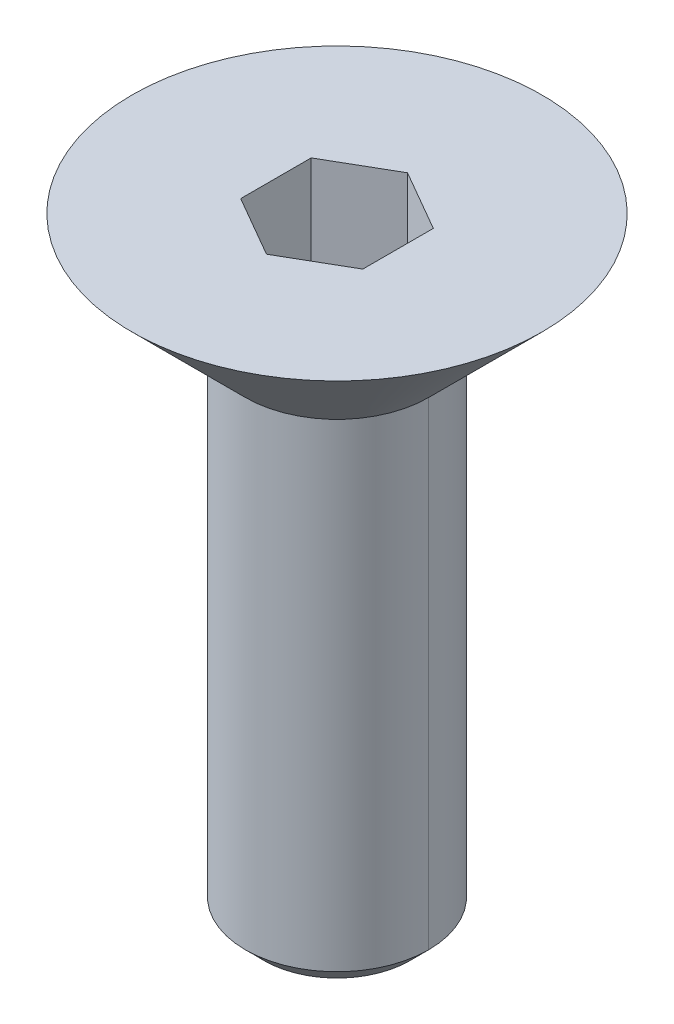
ISO-10303-21;
HEADER;
FILE_DESCRIPTION(('STEP AP214'),'2;1');
FILE_NAME('part.step','',(''),(''),'','','');
FILE_SCHEMA(('AUTOMOTIVE_DESIGN { 1 0 10303 214 1 1 1 1 }'));
ENDSEC;
DATA;
#1=APPLICATION_CONTEXT('core data for automotive mechanical design processes');
#2=APPLICATION_PROTOCOL_DEFINITION('international standard','automotive_design',2000,#1);
#3=PRODUCT_CONTEXT('',#1,'mechanical');
#4=PRODUCT('Part','Part','',(#3));
#5=PRODUCT_RELATED_PRODUCT_CATEGORY('part','',(#4));
#6=PRODUCT_DEFINITION_FORMATION('','',#4);
#7=PRODUCT_DEFINITION_CONTEXT('part definition',#1,'design');
#8=PRODUCT_DEFINITION('design','',#6,#7);
#9=PRODUCT_DEFINITION_SHAPE('','',#8);
#10=(LENGTH_UNIT() NAMED_UNIT(*) SI_UNIT(.MILLI.,.METRE.));
#11=(NAMED_UNIT(*) PLANE_ANGLE_UNIT() SI_UNIT($,.RADIAN.));
#12=(NAMED_UNIT(*) SI_UNIT($,.STERADIAN.) SOLID_ANGLE_UNIT());
#13=UNCERTAINTY_MEASURE_WITH_UNIT(LENGTH_MEASURE(1.E-05),#10,'distance_accuracy_value','');
#14=(GEOMETRIC_REPRESENTATION_CONTEXT(3) GLOBAL_UNCERTAINTY_ASSIGNED_CONTEXT((#13)) GLOBAL_UNIT_ASSIGNED_CONTEXT((#10,
#11,#12)) REPRESENTATION_CONTEXT('',''));
#15=CARTESIAN_POINT('',(0.,0.,0.));
#16=DIRECTION('',(0.,0.,1.));
#17=DIRECTION('',(1.,0.,0.));
#18=AXIS2_PLACEMENT_3D('',#15,#16,#17);
#19=CARTESIAN_POINT('',(52.5,133.86,0.));
#20=DIRECTION('',(0.,1.,0.));
#21=DIRECTION('',(-1.,0.,0.));
#22=AXIS2_PLACEMENT_3D('',#19,#20,#21);
#23=CONICAL_SURFACE('',#22,3.36,0.785398163397448);
#24=CARTESIAN_POINT('',(52.5,132.,0.));
#25=DIRECTION('',(0.,1.,0.));
#26=DIRECTION('',(1.,0.,0.));
#27=AXIS2_PLACEMENT_3D('',#24,#25,#26);
#28=CIRCLE('',#27,1.5);
#29=CARTESIAN_POINT('',(51.,132.,0.));
#30=VERTEX_POINT('',#29);
#31=CARTESIAN_POINT('',(54.,132.,0.));
#32=VERTEX_POINT('',#31);
#33=EDGE_CURVE('E284',#30,#32,#28,.T.);
#34=ORIENTED_EDGE('',*,*,#33,.T.);
#35=DIRECTION('',(0.707106781186546,0.707106781186549,0.));
#36=VECTOR('',#35,1.);
#37=CARTESIAN_POINT('',(55.86,133.86,0.));
#38=LINE('',#37,#36);
#39=CARTESIAN_POINT('',(55.86,133.86,0.));
#40=VERTEX_POINT('',#39);
#41=EDGE_CURVE('E256',#32,#40,#38,.T.);
#42=ORIENTED_EDGE('',*,*,#41,.T.);
#43=CARTESIAN_POINT('',(52.5,133.86,0.));
#44=DIRECTION('',(0.,1.,0.));
#45=DIRECTION('',(1.,0.,0.));
#46=AXIS2_PLACEMENT_3D('',#43,#44,#45);
#47=CIRCLE('',#46,3.36);
#48=CARTESIAN_POINT('',(49.14,133.86,0.));
#49=VERTEX_POINT('',#48);
#50=EDGE_CURVE('E191',#49,#40,#47,.T.);
#51=ORIENTED_EDGE('',*,*,#50,.F.);
#52=DIRECTION('',(-0.707106781186548,0.707106781186547,0.));
#53=VECTOR('',#52,1.);
#54=CARTESIAN_POINT('',(49.14,133.86,0.));
#55=LINE('',#54,#53);
#56=EDGE_CURVE('E269',#30,#49,#55,.T.);
#57=ORIENTED_EDGE('',*,*,#56,.F.);
#58=EDGE_LOOP('',(#34,#42,#51,#57));
#59=FACE_BOUND('',#58,.T.);
#60=ADVANCED_FACE('F17',(#59),#23,.T.);
#61=CARTESIAN_POINT('',(52.5,123.86,0.));
#62=DIRECTION('',(0.,1.,0.));
#63=DIRECTION('',(1.,0.,0.));
#64=AXIS2_PLACEMENT_3D('',#61,#62,#63);
#65=CYLINDRICAL_SURFACE('',#64,1.5);
#66=CARTESIAN_POINT('',(52.5,124.1665,0.));
#67=DIRECTION('',(0.,1.,0.));
#68=DIRECTION('',(1.,0.,0.));
#69=AXIS2_PLACEMENT_3D('',#66,#67,#68);
#70=CIRCLE('',#69,1.5);
#71=CARTESIAN_POINT('',(54.,124.1665,0.));
#72=VERTEX_POINT('',#71);
#73=CARTESIAN_POINT('',(51.,124.1665,0.));
#74=VERTEX_POINT('',#73);
#75=EDGE_CURVE('E193',#72,#74,#70,.T.);
#76=ORIENTED_EDGE('',*,*,#75,.T.);
#77=DIRECTION('',(0.,1.,0.));
#78=VECTOR('',#77,1.);
#79=CARTESIAN_POINT('',(51.,123.86,0.));
#80=LINE('',#79,#78);
#81=EDGE_CURVE('E272',#74,#30,#80,.T.);
#82=ORIENTED_EDGE('',*,*,#81,.T.);
#83=CARTESIAN_POINT('',(52.5,132.,0.));
#84=DIRECTION('',(0.,1.,0.));
#85=DIRECTION('',(1.,0.,0.));
#86=AXIS2_PLACEMENT_3D('',#83,#84,#85);
#87=CIRCLE('',#86,1.5);
#88=EDGE_CURVE('E259',#32,#30,#87,.T.);
#89=ORIENTED_EDGE('',*,*,#88,.F.);
#90=DIRECTION('',(0.,1.,0.));
#91=VECTOR('',#90,1.);
#92=CARTESIAN_POINT('',(54.,123.86,0.));
#93=LINE('',#92,#91);
#94=EDGE_CURVE('E280',#72,#32,#93,.T.);
#95=ORIENTED_EDGE('',*,*,#94,.F.);
#96=EDGE_LOOP('',(#76,#82,#89,#95));
#97=FACE_BOUND('',#96,.T.);
#98=ADVANCED_FACE('F361',(#97),#65,.T.);
#99=CARTESIAN_POINT('',(52.5,124.1665,0.));
#100=DIRECTION('',(0.,1.,0.));
#101=DIRECTION('',(-1.,0.,0.));
#102=AXIS2_PLACEMENT_3D('',#99,#100,#101);
#103=CONICAL_SURFACE('',#102,1.5,0.785398163397447);
#104=CARTESIAN_POINT('',(52.5,123.86,0.));
#105=DIRECTION('',(0.,1.,0.));
#106=DIRECTION('',(1.,0.,0.));
#107=AXIS2_PLACEMENT_3D('',#104,#105,#106);
#108=CIRCLE('',#107,1.1935);
#109=CARTESIAN_POINT('',(51.3065,123.86,0.));
#110=VERTEX_POINT('',#109);
#111=CARTESIAN_POINT('',(53.6935,123.86,0.));
#112=VERTEX_POINT('',#111);
#113=EDGE_CURVE('E166',#110,#112,#108,.T.);
#114=ORIENTED_EDGE('',*,*,#113,.T.);
#115=DIRECTION('',(0.707106781186546,0.707106781186549,0.));
#116=VECTOR('',#115,1.);
#117=CARTESIAN_POINT('',(54.,124.1665,0.));
#118=LINE('',#117,#116);
#119=EDGE_CURVE('E290',#112,#72,#118,.T.);
#120=ORIENTED_EDGE('',*,*,#119,.T.);
#121=CARTESIAN_POINT('',(52.5,124.1665,0.));
#122=DIRECTION('',(0.,1.,0.));
#123=DIRECTION('',(1.,0.,0.));
#124=AXIS2_PLACEMENT_3D('',#121,#122,#123);
#125=CIRCLE('',#124,1.5);
#126=EDGE_CURVE('E276',#74,#72,#125,.T.);
#127=ORIENTED_EDGE('',*,*,#126,.F.);
#128=DIRECTION('',(-0.707106781186547,0.707106781186548,0.));
#129=VECTOR('',#128,1.);
#130=CARTESIAN_POINT('',(51.,124.1665,0.));
#131=LINE('',#130,#129);
#132=EDGE_CURVE('E195',#110,#74,#131,.T.);
#133=ORIENTED_EDGE('',*,*,#132,.F.);
#134=EDGE_LOOP('',(#114,#120,#127,#133));
#135=FACE_BOUND('',#134,.T.);
#136=ADVANCED_FACE('F366',(#135),#103,.T.);
#137=CARTESIAN_POINT('',(52.5,390.81904510252,-2.2469312405695E-13));
#138=DIRECTION('',(0.,1.,0.));
#139=DIRECTION('',(-1.,0.,0.));
#140=AXIS2_PLACEMENT_3D('',#137,#138,#139);
#141=CONICAL_SURFACE('',#140,965.925826289068,1.30899693899575);
#142=DIRECTION('',(-0.965925826289069,0.258819045102518,0.));
#143=VECTOR('',#142,1.);
#144=CARTESIAN_POINT('',(-913.425826289068,390.819045102519,-3.65308832713709E-13));
#145=LINE('',#144,#143);
#146=CARTESIAN_POINT('',(52.5,132.,0.));
#147=VERTEX_POINT('',#146);
#148=CARTESIAN_POINT('',(51.5,132.26794919243,0.));
#149=VERTEX_POINT('',#148);
#150=EDGE_CURVE('E38',#147,#149,#145,.T.);
#151=ORIENTED_EDGE('',*,*,#150,.F.);
#152=DIRECTION('',(0.965925826289069,0.258819045102519,0.));
#153=VECTOR('',#152,1.);
#154=CARTESIAN_POINT('',(1018.42582628907,390.819045102521,0.));
#155=LINE('',#154,#153);
#156=CARTESIAN_POINT('',(53.5,132.26794919243,0.));
#157=VERTEX_POINT('',#156);
#158=EDGE_CURVE('E246',#147,#157,#155,.T.);
#159=ORIENTED_EDGE('',*,*,#158,.T.);
#160=CARTESIAN_POINT('',(52.5,132.26794919243,0.));
#161=DIRECTION('',(0.,1.,0.));
#162=DIRECTION('',(1.,0.,0.));
#163=AXIS2_PLACEMENT_3D('',#160,#161,#162);
#164=CIRCLE('',#163,1.);
#165=CARTESIAN_POINT('',(53.,132.26794919243,-0.866025403784361));
#166=VERTEX_POINT('',#165);
#167=EDGE_CURVE('E11',#157,#166,#164,.T.);
#168=ORIENTED_EDGE('',*,*,#167,.T.);
#169=CARTESIAN_POINT('',(52.5,132.26794919243,0.));
#170=DIRECTION('',(0.,1.,0.));
#171=DIRECTION('',(1.,0.,0.));
#172=AXIS2_PLACEMENT_3D('',#169,#170,#171);
#173=CIRCLE('',#172,1.);
#174=CARTESIAN_POINT('',(52.,132.26794919243,-0.866025403784361));
#175=VERTEX_POINT('',#174);
#176=EDGE_CURVE('E219',#166,#175,#173,.T.);
#177=ORIENTED_EDGE('',*,*,#176,.T.);
#178=CARTESIAN_POINT('',(52.5,132.26794919243,0.));
#179=DIRECTION('',(0.,1.,0.));
#180=DIRECTION('',(1.,0.,0.));
#181=AXIS2_PLACEMENT_3D('',#178,#179,#180);
#182=CIRCLE('',#181,1.);
#183=EDGE_CURVE('E172',#175,#149,#182,.T.);
#184=ORIENTED_EDGE('',*,*,#183,.T.);
#185=EDGE_LOOP('',(#151,#159,#168,#177,#184));
#186=FACE_BOUND('',#185,.T.);
#187=ADVANCED_FACE('F327',(#186),#141,.F.);
#188=CARTESIAN_POINT('',(52.5,132.26794919243,0.));
#189=DIRECTION('',(0.,-1.,0.));
#190=DIRECTION('',(-1.,0.,0.));
#191=AXIS2_PLACEMENT_3D('',#188,#189,#190);
#192=PLANE('',#191);
#193=DIRECTION('',(0.866025403784439,0.,-0.5));
#194=VECTOR('',#193,1.);
#195=CARTESIAN_POINT('',(52.5,132.26794919243,1.15470053837933));
#196=LINE('',#195,#194);
#197=CARTESIAN_POINT('',(52.5,132.26794919243,1.15470053837933));
#198=VERTEX_POINT('',#197);
#199=CARTESIAN_POINT('',(53.,132.26794919243,0.866025403784517));
#200=VERTEX_POINT('',#199);
#201=EDGE_CURVE('E202',#198,#200,#196,.T.);
#202=ORIENTED_EDGE('',*,*,#201,.T.);
#203=CARTESIAN_POINT('',(52.5,132.26794919243,0.));
#204=DIRECTION('',(0.,1.,0.));
#205=DIRECTION('',(1.,0.,0.));
#206=AXIS2_PLACEMENT_3D('',#203,#204,#205);
#207=CIRCLE('',#206,1.);
#208=CARTESIAN_POINT('',(52.,132.26794919243,0.866025403784517));
#209=VERTEX_POINT('',#208);
#210=EDGE_CURVE('E210',#209,#200,#207,.T.);
#211=ORIENTED_EDGE('',*,*,#210,.F.);
#212=DIRECTION('',(0.866025403784439,0.,0.5));
#213=VECTOR('',#212,1.);
#214=CARTESIAN_POINT('',(51.5,132.26794919243,0.577350269189704));
#215=LINE('',#214,#213);
#216=EDGE_CURVE('E206',#209,#198,#215,.T.);
#217=ORIENTED_EDGE('',*,*,#216,.T.);
#218=EDGE_LOOP('',(#202,#211,#217));
#219=FACE_BOUND('',#218,.T.);
#220=ADVANCED_FACE('F638',(#219),#192,.F.);
#221=CARTESIAN_POINT('',(52.5,132.26794919243,0.));
#222=DIRECTION('',(0.,-1.,0.));
#223=DIRECTION('',(-1.,0.,0.));
#224=AXIS2_PLACEMENT_3D('',#221,#222,#223);
#225=PLANE('',#224);
#226=DIRECTION('',(0.,0.,-1.));
#227=VECTOR('',#226,1.);
#228=CARTESIAN_POINT('',(53.5,132.26794919243,0.577350269189705));
#229=LINE('',#228,#227);
#230=CARTESIAN_POINT('',(53.5,132.26794919243,0.577350269189705));
#231=VERTEX_POINT('',#230);
#232=EDGE_CURVE('E311',#231,#157,#229,.T.);
#233=ORIENTED_EDGE('',*,*,#232,.T.);
#234=CARTESIAN_POINT('',(52.5,132.26794919243,0.));
#235=DIRECTION('',(0.,1.,0.));
#236=DIRECTION('',(1.,0.,0.));
#237=AXIS2_PLACEMENT_3D('',#234,#235,#236);
#238=CIRCLE('',#237,1.);
#239=EDGE_CURVE('E25',#200,#157,#238,.T.);
#240=ORIENTED_EDGE('',*,*,#239,.F.);
#241=DIRECTION('',(0.866025403784439,0.,-0.5));
#242=VECTOR('',#241,1.);
#243=CARTESIAN_POINT('',(52.5,132.26794919243,1.15470053837933));
#244=LINE('',#243,#242);
#245=EDGE_CURVE('E265',#200,#231,#244,.T.);
#246=ORIENTED_EDGE('',*,*,#245,.T.);
#247=EDGE_LOOP('',(#233,#240,#246));
#248=FACE_BOUND('',#247,.T.);
#249=ADVANCED_FACE('F334',(#248),#225,.F.);
#250=CARTESIAN_POINT('',(52.5,132.26794919243,0.));
#251=DIRECTION('',(0.,-1.,0.));
#252=DIRECTION('',(-1.,0.,0.));
#253=AXIS2_PLACEMENT_3D('',#250,#251,#252);
#254=PLANE('',#253);
#255=DIRECTION('',(-0.866025403784439,0.,-0.5));
#256=VECTOR('',#255,1.);
#257=CARTESIAN_POINT('',(53.5,132.26794919243,-0.577350269189548));
#258=LINE('',#257,#256);
#259=CARTESIAN_POINT('',(53.5,132.26794919243,-0.577350269189548));
#260=VERTEX_POINT('',#259);
#261=EDGE_CURVE('E49',#260,#166,#258,.T.);
#262=ORIENTED_EDGE('',*,*,#261,.T.);
#263=ORIENTED_EDGE('',*,*,#167,.F.);
#264=DIRECTION('',(0.,0.,-1.));
#265=VECTOR('',#264,1.);
#266=CARTESIAN_POINT('',(53.5,132.26794919243,0.577350269189705));
#267=LINE('',#266,#265);
#268=EDGE_CURVE('E252',#157,#260,#267,.T.);
#269=ORIENTED_EDGE('',*,*,#268,.T.);
#270=EDGE_LOOP('',(#262,#263,#269));
#271=FACE_BOUND('',#270,.T.);
#272=ADVANCED_FACE('F577',(#271),#254,.F.);
#273=CARTESIAN_POINT('',(52.5,390.81904510252,-2.2469312405695E-13));
#274=DIRECTION('',(0.,1.,0.));
#275=DIRECTION('',(-1.,0.,0.));
#276=AXIS2_PLACEMENT_3D('',#273,#274,#275);
#277=CONICAL_SURFACE('',#276,965.925826289068,1.30899693899575);
#278=ORIENTED_EDGE('',*,*,#158,.F.);
#279=ORIENTED_EDGE('',*,*,#150,.T.);
#280=CARTESIAN_POINT('',(52.5,132.26794919243,0.));
#281=DIRECTION('',(0.,1.,0.));
#282=DIRECTION('',(1.,0.,0.));
#283=AXIS2_PLACEMENT_3D('',#280,#281,#282);
#284=CIRCLE('',#283,1.);
#285=EDGE_CURVE('E200',#149,#209,#284,.T.);
#286=ORIENTED_EDGE('',*,*,#285,.T.);
#287=ORIENTED_EDGE('',*,*,#210,.T.);
#288=ORIENTED_EDGE('',*,*,#239,.T.);
#289=EDGE_LOOP('',(#278,#279,#286,#287,#288));
#290=FACE_BOUND('',#289,.T.);
#291=ADVANCED_FACE('F325',(#290),#277,.F.);
#292=CARTESIAN_POINT('',(52.5,132.26794919243,-1.15470053837917));
#293=DIRECTION('',(0.5,0.,0.866025403784439));
#294=DIRECTION('',(0.,-1.,0.));
#295=AXIS2_PLACEMENT_3D('',#292,#293,#294);
#296=PLANE('',#295);
#297=DIRECTION('',(-0.866025403784439,0.,0.5));
#298=VECTOR('',#297,1.);
#299=CARTESIAN_POINT('',(52.5,132.26794919243,-1.15470053837917));
#300=LINE('',#299,#298);
#301=CARTESIAN_POINT('',(52.5,132.26794919243,-1.15470053837917));
#302=VERTEX_POINT('',#301);
#303=EDGE_CURVE('E174',#302,#175,#300,.T.);
#304=ORIENTED_EDGE('',*,*,#303,.F.);
#305=DIRECTION('',(0.,1.,0.));
#306=VECTOR('',#305,1.);
#307=CARTESIAN_POINT('',(52.5,132.26794919243,-1.15470053837917));
#308=LINE('',#307,#306);
#309=CARTESIAN_POINT('',(52.5,133.86,-1.15470053837917));
#310=VERTEX_POINT('',#309);
#311=EDGE_CURVE('E249',#302,#310,#308,.T.);
#312=ORIENTED_EDGE('',*,*,#311,.T.);
#313=DIRECTION('',(0.866025403784439,0.,-0.5));
#314=VECTOR('',#313,1.);
#315=CARTESIAN_POINT('',(52.4330127018922,133.86,-1.11602540378436));
#316=LINE('',#315,#314);
#317=CARTESIAN_POINT('',(51.5,133.86,-0.57735026918955));
#318=VERTEX_POINT('',#317);
#319=EDGE_CURVE('E159',#318,#310,#316,.T.);
#320=ORIENTED_EDGE('',*,*,#319,.F.);
#321=DIRECTION('',(0.,1.,0.));
#322=VECTOR('',#321,1.);
#323=CARTESIAN_POINT('',(51.5,132.26794919243,-0.577350269189548));
#324=LINE('',#323,#322);
#325=CARTESIAN_POINT('',(51.5,132.26794919243,-0.577350269189548));
#326=VERTEX_POINT('',#325);
#327=EDGE_CURVE('E152',#326,#318,#324,.T.);
#328=ORIENTED_EDGE('',*,*,#327,.F.);
#329=DIRECTION('',(-0.866025403784439,0.,0.5));
#330=VECTOR('',#329,1.);
#331=CARTESIAN_POINT('',(52.5,132.26794919243,-1.15470053837917));
#332=LINE('',#331,#330);
#333=EDGE_CURVE('E156',#175,#326,#332,.T.);
#334=ORIENTED_EDGE('',*,*,#333,.F.);
#335=EDGE_LOOP('',(#304,#312,#320,#328,#334));
#336=FACE_BOUND('',#335,.T.);
#337=ADVANCED_FACE('F155',(#336),#296,.T.);
#338=CARTESIAN_POINT('',(53.5,132.26794919243,-0.577350269189548));
#339=DIRECTION('',(-0.5,0.,0.866025403784439));
#340=DIRECTION('',(0.,1.,0.));
#341=AXIS2_PLACEMENT_3D('',#338,#339,#340);
#342=PLANE('',#341);
#343=ORIENTED_EDGE('',*,*,#261,.F.);
#344=DIRECTION('',(0.,1.,0.));
#345=VECTOR('',#344,1.);
#346=CARTESIAN_POINT('',(53.5,132.26794919243,-0.577350269189548));
#347=LINE('',#346,#345);
#348=CARTESIAN_POINT('',(53.5,133.86,-0.57735026918955));
#349=VERTEX_POINT('',#348);
#350=EDGE_CURVE('E315',#260,#349,#347,.T.);
#351=ORIENTED_EDGE('',*,*,#350,.T.);
#352=DIRECTION('',(0.866025403784439,0.,0.5));
#353=VECTOR('',#352,1.);
#354=CARTESIAN_POINT('',(52.5669872981078,133.86,-1.11602540378436));
#355=LINE('',#354,#353);
#356=EDGE_CURVE('E241',#310,#349,#355,.T.);
#357=ORIENTED_EDGE('',*,*,#356,.F.);
#358=ORIENTED_EDGE('',*,*,#311,.F.);
#359=DIRECTION('',(-0.866025403784439,0.,-0.5));
#360=VECTOR('',#359,1.);
#361=CARTESIAN_POINT('',(53.5,132.26794919243,-0.577350269189548));
#362=LINE('',#361,#360);
#363=EDGE_CURVE('E201',#166,#302,#362,.T.);
#364=ORIENTED_EDGE('',*,*,#363,.F.);
#365=EDGE_LOOP('',(#343,#351,#357,#358,#364));
#366=FACE_BOUND('',#365,.T.);
#367=ADVANCED_FACE('F344',(#366),#342,.T.);
#368=CARTESIAN_POINT('',(53.5,132.26794919243,0.577350269189705));
#369=DIRECTION('',(-1.,0.,0.));
#370=DIRECTION('',(0.,1.,0.));
#371=AXIS2_PLACEMENT_3D('',#368,#369,#370);
#372=PLANE('',#371);
#373=ORIENTED_EDGE('',*,*,#232,.F.);
#374=DIRECTION('',(0.,1.,0.));
#375=VECTOR('',#374,1.);
#376=CARTESIAN_POINT('',(53.5,132.26794919243,0.577350269189705));
#377=LINE('',#376,#375);
#378=CARTESIAN_POINT('',(53.5,133.86,0.577350269189703));
#379=VERTEX_POINT('',#378);
#380=EDGE_CURVE('E205',#231,#379,#377,.T.);
#381=ORIENTED_EDGE('',*,*,#380,.T.);
#382=DIRECTION('',(0.,0.,1.));
#383=VECTOR('',#382,1.);
#384=CARTESIAN_POINT('',(53.5,133.86,-0.999999999999923));
#385=LINE('',#384,#383);
#386=EDGE_CURVE('E245',#349,#379,#385,.T.);
#387=ORIENTED_EDGE('',*,*,#386,.F.);
#388=ORIENTED_EDGE('',*,*,#350,.F.);
#389=ORIENTED_EDGE('',*,*,#268,.F.);
#390=EDGE_LOOP('',(#373,#381,#387,#388,#389));
#391=FACE_BOUND('',#390,.T.);
#392=ADVANCED_FACE('F330',(#391),#372,.T.);
#393=CARTESIAN_POINT('',(52.5,132.26794919243,1.15470053837933));
#394=DIRECTION('',(-0.5,0.,-0.866025403784439));
#395=DIRECTION('',(-0.866025403784439,0.,0.5));
#396=AXIS2_PLACEMENT_3D('',#393,#394,#395);
#397=PLANE('',#396);
#398=ORIENTED_EDGE('',*,*,#201,.F.);
#399=DIRECTION('',(0.,1.,0.));
#400=VECTOR('',#399,1.);
#401=CARTESIAN_POINT('',(52.5,132.26794919243,1.15470053837933));
#402=LINE('',#401,#400);
#403=CARTESIAN_POINT('',(52.5,133.86,1.15470053837933));
#404=VERTEX_POINT('',#403);
#405=EDGE_CURVE('E288',#198,#404,#402,.T.);
#406=ORIENTED_EDGE('',*,*,#405,.T.);
#407=DIRECTION('',(-0.866025403784439,0.,0.5));
#408=VECTOR('',#407,1.);
#409=CARTESIAN_POINT('',(53.4330127018922,133.86,0.616025403784516));
#410=LINE('',#409,#408);
#411=EDGE_CURVE('E226',#379,#404,#410,.T.);
#412=ORIENTED_EDGE('',*,*,#411,.F.);
#413=ORIENTED_EDGE('',*,*,#380,.F.);
#414=ORIENTED_EDGE('',*,*,#245,.F.);
#415=EDGE_LOOP('',(#398,#406,#412,#413,#414));
#416=FACE_BOUND('',#415,.T.);
#417=ADVANCED_FACE('F339',(#416),#397,.T.);
#418=CARTESIAN_POINT('',(51.5,132.26794919243,0.577350269189704));
#419=DIRECTION('',(0.5,0.,-0.866025403784439));
#420=DIRECTION('',(0.,-1.,0.));
#421=AXIS2_PLACEMENT_3D('',#418,#419,#420);
#422=PLANE('',#421);
#423=DIRECTION('',(0.866025403784439,0.,0.5));
#424=VECTOR('',#423,1.);
#425=CARTESIAN_POINT('',(51.5,132.26794919243,0.577350269189704));
#426=LINE('',#425,#424);
#427=CARTESIAN_POINT('',(51.5,132.26794919243,0.577350269189704));
#428=VERTEX_POINT('',#427);
#429=EDGE_CURVE('E196',#428,#209,#426,.T.);
#430=ORIENTED_EDGE('',*,*,#429,.F.);
#431=DIRECTION('',(0.,1.,0.));
#432=VECTOR('',#431,1.);
#433=CARTESIAN_POINT('',(51.5,132.26794919243,0.577350269189704));
#434=LINE('',#433,#432);
#435=CARTESIAN_POINT('',(51.5,133.86,0.577350269189703));
#436=VERTEX_POINT('',#435);
#437=EDGE_CURVE('E165',#428,#436,#434,.T.);
#438=ORIENTED_EDGE('',*,*,#437,.T.);
#439=DIRECTION('',(-0.866025403784439,0.,-0.5));
#440=VECTOR('',#439,1.);
#441=CARTESIAN_POINT('',(51.5669872981078,133.86,0.616025403784515));
#442=LINE('',#441,#440);
#443=EDGE_CURVE('E215',#404,#436,#442,.T.);
#444=ORIENTED_EDGE('',*,*,#443,.F.);
#445=ORIENTED_EDGE('',*,*,#405,.F.);
#446=ORIENTED_EDGE('',*,*,#216,.F.);
#447=EDGE_LOOP('',(#430,#438,#444,#445,#446));
#448=FACE_BOUND('',#447,.T.);
#449=ADVANCED_FACE('F549',(#448),#422,.T.);
#450=CARTESIAN_POINT('',(51.5,132.26794919243,-0.577350269189548));
#451=DIRECTION('',(1.,0.,0.));
#452=DIRECTION('',(0.,1.,0.));
#453=AXIS2_PLACEMENT_3D('',#450,#451,#452);
#454=PLANE('',#453);
#455=DIRECTION('',(0.,0.,1.));
#456=VECTOR('',#455,1.);
#457=CARTESIAN_POINT('',(51.5,132.26794919243,-0.577350269189548));
#458=LINE('',#457,#456);
#459=EDGE_CURVE('E171',#326,#149,#458,.T.);
#460=ORIENTED_EDGE('',*,*,#459,.F.);
#461=ORIENTED_EDGE('',*,*,#327,.T.);
#462=DIRECTION('',(0.,0.,-1.));
#463=VECTOR('',#462,1.);
#464=CARTESIAN_POINT('',(51.5,133.86,-0.999999999999924));
#465=LINE('',#464,#463);
#466=EDGE_CURVE('E212',#436,#318,#465,.T.);
#467=ORIENTED_EDGE('',*,*,#466,.F.);
#468=ORIENTED_EDGE('',*,*,#437,.F.);
#469=DIRECTION('',(0.,0.,1.));
#470=VECTOR('',#469,1.);
#471=CARTESIAN_POINT('',(51.5,132.26794919243,-0.577350269189548));
#472=LINE('',#471,#470);
#473=EDGE_CURVE('E179',#149,#428,#472,.T.);
#474=ORIENTED_EDGE('',*,*,#473,.F.);
#475=EDGE_LOOP('',(#460,#461,#467,#468,#474));
#476=FACE_BOUND('',#475,.T.);
#477=ADVANCED_FACE('F177',(#476),#454,.T.);
#478=CARTESIAN_POINT('',(52.5,123.86,-1.19349999999991));
#479=DIRECTION('',(0.,1.,0.));
#480=DIRECTION('',(0.,0.,-1.));
#481=AXIS2_PLACEMENT_3D('',#478,#479,#480);
#482=PLANE('',#481);
#483=ORIENTED_EDGE('',*,*,#113,.F.);
#484=CARTESIAN_POINT('',(52.5,123.86,0.));
#485=DIRECTION('',(0.,1.,0.));
#486=DIRECTION('',(1.,0.,0.));
#487=AXIS2_PLACEMENT_3D('',#484,#485,#486);
#488=CIRCLE('',#487,1.1935);
#489=EDGE_CURVE('E295',#112,#110,#488,.T.);
#490=ORIENTED_EDGE('',*,*,#489,.F.);
#491=EDGE_LOOP('',(#483,#490));
#492=FACE_BOUND('',#491,.T.);
#493=ADVANCED_FACE('F585',(#492),#482,.F.);
#494=CARTESIAN_POINT('',(52.5,124.1665,0.));
#495=DIRECTION('',(0.,1.,0.));
#496=DIRECTION('',(-1.,0.,0.));
#497=AXIS2_PLACEMENT_3D('',#494,#495,#496);
#498=CONICAL_SURFACE('',#497,1.5,0.785398163397447);
#499=ORIENTED_EDGE('',*,*,#119,.F.);
#500=ORIENTED_EDGE('',*,*,#489,.T.);
#501=ORIENTED_EDGE('',*,*,#132,.T.);
#502=ORIENTED_EDGE('',*,*,#75,.F.);
#503=EDGE_LOOP('',(#499,#500,#501,#502));
#504=FACE_BOUND('',#503,.T.);
#505=ADVANCED_FACE('F569',(#504),#498,.T.);
#506=CARTESIAN_POINT('',(52.5,123.86,0.));
#507=DIRECTION('',(0.,1.,0.));
#508=DIRECTION('',(1.,0.,0.));
#509=AXIS2_PLACEMENT_3D('',#506,#507,#508);
#510=CYLINDRICAL_SURFACE('',#509,1.5);
#511=ORIENTED_EDGE('',*,*,#81,.F.);
#512=ORIENTED_EDGE('',*,*,#126,.T.);
#513=ORIENTED_EDGE('',*,*,#94,.T.);
#514=ORIENTED_EDGE('',*,*,#33,.F.);
#515=EDGE_LOOP('',(#511,#512,#513,#514));
#516=FACE_BOUND('',#515,.T.);
#517=ADVANCED_FACE('F376',(#516),#510,.T.);
#518=CARTESIAN_POINT('',(52.5,133.86,0.));
#519=DIRECTION('',(0.,1.,0.));
#520=DIRECTION('',(-1.,0.,0.));
#521=AXIS2_PLACEMENT_3D('',#518,#519,#520);
#522=CONICAL_SURFACE('',#521,3.36,0.785398163397448);
#523=ORIENTED_EDGE('',*,*,#41,.F.);
#524=ORIENTED_EDGE('',*,*,#88,.T.);
#525=ORIENTED_EDGE('',*,*,#56,.T.);
#526=CARTESIAN_POINT('',(52.5,133.86,0.));
#527=DIRECTION('',(0.,1.,0.));
#528=DIRECTION('',(1.,0.,0.));
#529=AXIS2_PLACEMENT_3D('',#526,#527,#528);
#530=CIRCLE('',#529,3.36);
#531=EDGE_CURVE('E222',#40,#49,#530,.T.);
#532=ORIENTED_EDGE('',*,*,#531,.F.);
#533=EDGE_LOOP('',(#523,#524,#525,#532));
#534=FACE_BOUND('',#533,.T.);
#535=ADVANCED_FACE('F379',(#534),#522,.T.);
#536=CARTESIAN_POINT('',(52.5,133.86,-0.999999999999924));
#537=DIRECTION('',(0.,-1.,0.));
#538=DIRECTION('',(-1.,0.,0.));
#539=AXIS2_PLACEMENT_3D('',#536,#537,#538);
#540=PLANE('',#539);
#541=ORIENTED_EDGE('',*,*,#411,.T.);
#542=ORIENTED_EDGE('',*,*,#443,.T.);
#543=ORIENTED_EDGE('',*,*,#466,.T.);
#544=ORIENTED_EDGE('',*,*,#319,.T.);
#545=ORIENTED_EDGE('',*,*,#356,.T.);
#546=ORIENTED_EDGE('',*,*,#386,.T.);
#547=EDGE_LOOP('',(#541,#542,#543,#544,#545,#546));
#548=FACE_BOUND('',#547,.T.);
#549=ORIENTED_EDGE('',*,*,#50,.T.);
#550=ORIENTED_EDGE('',*,*,#531,.T.);
#551=EDGE_LOOP('',(#549,#550));
#552=FACE_BOUND('',#551,.T.);
#553=ADVANCED_FACE('F341',(#548,#552),#540,.F.);
#554=CARTESIAN_POINT('',(52.5,132.26794919243,0.));
#555=DIRECTION('',(0.,-1.,0.));
#556=DIRECTION('',(-1.,0.,0.));
#557=AXIS2_PLACEMENT_3D('',#554,#555,#556);
#558=PLANE('',#557);
#559=ORIENTED_EDGE('',*,*,#429,.T.);
#560=ORIENTED_EDGE('',*,*,#285,.F.);
#561=ORIENTED_EDGE('',*,*,#473,.T.);
#562=EDGE_LOOP('',(#559,#560,#561));
#563=FACE_BOUND('',#562,.T.);
#564=ADVANCED_FACE('F349',(#563),#558,.F.);
#565=CARTESIAN_POINT('',(52.5,132.26794919243,0.));
#566=DIRECTION('',(0.,-1.,0.));
#567=DIRECTION('',(-1.,0.,0.));
#568=AXIS2_PLACEMENT_3D('',#565,#566,#567);
#569=PLANE('',#568);
#570=ORIENTED_EDGE('',*,*,#303,.T.);
#571=ORIENTED_EDGE('',*,*,#176,.F.);
#572=ORIENTED_EDGE('',*,*,#363,.T.);
#573=EDGE_LOOP('',(#570,#571,#572));
#574=FACE_BOUND('',#573,.T.);
#575=ADVANCED_FACE('F347',(#574),#569,.F.);
#576=CARTESIAN_POINT('',(52.5,132.26794919243,0.));
#577=DIRECTION('',(0.,-1.,0.));
#578=DIRECTION('',(-1.,0.,0.));
#579=AXIS2_PLACEMENT_3D('',#576,#577,#578);
#580=PLANE('',#579);
#581=ORIENTED_EDGE('',*,*,#459,.T.);
#582=ORIENTED_EDGE('',*,*,#183,.F.);
#583=ORIENTED_EDGE('',*,*,#333,.T.);
#584=EDGE_LOOP('',(#581,#582,#583));
#585=FACE_BOUND('',#584,.T.);
#586=ADVANCED_FACE('F170',(#585),#580,.F.);
#587=CLOSED_SHELL('',(#60,#98,#136,#187,#220,#249,#272,#291,#337,#367,#392,#417,#449,#477,#493,
#505,#517,#535,#553,#564,#575,#586));
#588=MANIFOLD_SOLID_BREP('B1',#587);
#589=ADVANCED_BREP_SHAPE_REPRESENTATION('',(#18,#588),#14);
#590=SHAPE_DEFINITION_REPRESENTATION(#9,#589);
ENDSEC;
END-ISO-10303-21;
